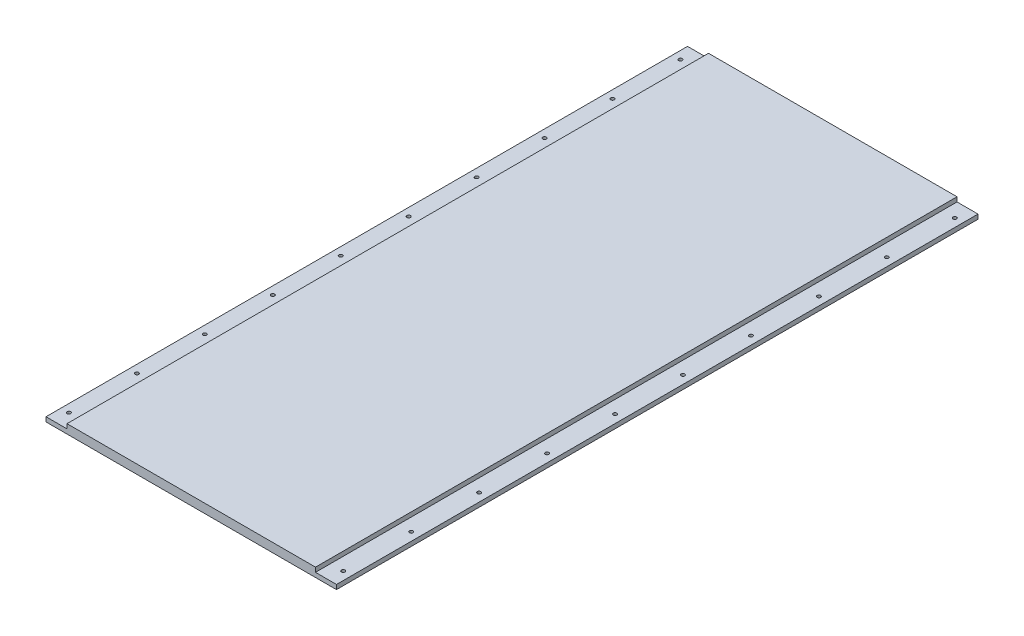
ISO-10303-21;
HEADER;
FILE_DESCRIPTION(('STEP AP214'),'2;1');
FILE_NAME('part.step','',(''),(''),'','','');
FILE_SCHEMA(('AUTOMOTIVE_DESIGN { 1 0 10303 214 1 1 1 1 }'));
ENDSEC;
DATA;
#1=APPLICATION_CONTEXT('core data for automotive mechanical design processes');
#2=APPLICATION_PROTOCOL_DEFINITION('international standard','automotive_design',2000,#1);
#3=PRODUCT_CONTEXT('',#1,'mechanical');
#4=PRODUCT('Part','Part','',(#3));
#5=PRODUCT_RELATED_PRODUCT_CATEGORY('part','',(#4));
#6=PRODUCT_DEFINITION_FORMATION('','',#4);
#7=PRODUCT_DEFINITION_CONTEXT('part definition',#1,'design');
#8=PRODUCT_DEFINITION('design','',#6,#7);
#9=PRODUCT_DEFINITION_SHAPE('','',#8);
#10=(LENGTH_UNIT() NAMED_UNIT(*) SI_UNIT(.MILLI.,.METRE.));
#11=(NAMED_UNIT(*) PLANE_ANGLE_UNIT() SI_UNIT($,.RADIAN.));
#12=(NAMED_UNIT(*) SI_UNIT($,.STERADIAN.) SOLID_ANGLE_UNIT());
#13=UNCERTAINTY_MEASURE_WITH_UNIT(LENGTH_MEASURE(1.E-05),#10,'distance_accuracy_value','');
#14=(GEOMETRIC_REPRESENTATION_CONTEXT(3) GLOBAL_UNCERTAINTY_ASSIGNED_CONTEXT((#13)) GLOBAL_UNIT_ASSIGNED_CONTEXT((#10,
#11,#12)) REPRESENTATION_CONTEXT('',''));
#15=CARTESIAN_POINT('',(0.,0.,0.));
#16=DIRECTION('',(0.,0.,1.));
#17=DIRECTION('',(1.,0.,0.));
#18=AXIS2_PLACEMENT_3D('',#15,#16,#17);
#19=CARTESIAN_POINT('',(-48.45,3.,107.));
#20=DIRECTION('',(1.,0.,0.));
#21=DIRECTION('',(0.,0.,-1.));
#22=AXIS2_PLACEMENT_3D('',#19,#20,#21);
#23=PLANE('',#22);
#24=DIRECTION('',(0.,0.,1.));
#25=VECTOR('',#24,1.);
#26=CARTESIAN_POINT('',(-48.45,1.5,-107.));
#27=LINE('',#26,#25);
#28=CARTESIAN_POINT('',(-48.45,1.5,-107.));
#29=VERTEX_POINT('',#28);
#30=CARTESIAN_POINT('',(-48.45,1.5,107.));
#31=VERTEX_POINT('',#30);
#32=EDGE_CURVE('E119',#29,#31,#27,.T.);
#33=ORIENTED_EDGE('',*,*,#32,.F.);
#34=DIRECTION('',(0.,-1.,0.));
#35=VECTOR('',#34,1.);
#36=CARTESIAN_POINT('',(-48.45,3.,-107.));
#37=LINE('',#36,#35);
#38=CARTESIAN_POINT('',(-48.45,0.,-107.));
#39=VERTEX_POINT('',#38);
#40=EDGE_CURVE('E51',#29,#39,#37,.T.);
#41=ORIENTED_EDGE('',*,*,#40,.T.);
#42=DIRECTION('',(0.,0.,1.));
#43=VECTOR('',#42,1.);
#44=CARTESIAN_POINT('',(-48.45,0.,107.));
#45=LINE('',#44,#43);
#46=CARTESIAN_POINT('',(-48.45,0.,107.));
#47=VERTEX_POINT('',#46);
#48=EDGE_CURVE('E142',#39,#47,#45,.T.);
#49=ORIENTED_EDGE('',*,*,#48,.T.);
#50=DIRECTION('',(0.,-1.,0.));
#51=VECTOR('',#50,1.);
#52=CARTESIAN_POINT('',(-48.45,3.,107.));
#53=LINE('',#52,#51);
#54=EDGE_CURVE('E136',#31,#47,#53,.T.);
#55=ORIENTED_EDGE('',*,*,#54,.F.);
#56=EDGE_LOOP('',(#33,#41,#49,#55));
#57=FACE_BOUND('',#56,.T.);
#58=ADVANCED_FACE('F41',(#57),#23,.F.);
#59=CARTESIAN_POINT('',(48.45,3.,107.));
#60=DIRECTION('',(-1.,0.,0.));
#61=DIRECTION('',(0.,0.,1.));
#62=AXIS2_PLACEMENT_3D('',#59,#60,#61);
#63=PLANE('',#62);
#64=DIRECTION('',(0.,-1.,0.));
#65=VECTOR('',#64,1.);
#66=CARTESIAN_POINT('',(48.45,3.,-107.));
#67=LINE('',#66,#65);
#68=CARTESIAN_POINT('',(48.45,1.5,-107.));
#69=VERTEX_POINT('',#68);
#70=CARTESIAN_POINT('',(48.45,0.,-107.));
#71=VERTEX_POINT('',#70);
#72=EDGE_CURVE('E11',#69,#71,#67,.T.);
#73=ORIENTED_EDGE('',*,*,#72,.F.);
#74=DIRECTION('',(0.,0.,-1.));
#75=VECTOR('',#74,1.);
#76=CARTESIAN_POINT('',(48.45,1.5,-107.));
#77=LINE('',#76,#75);
#78=CARTESIAN_POINT('',(48.45,1.5,107.));
#79=VERTEX_POINT('',#78);
#80=EDGE_CURVE('E314',#79,#69,#77,.T.);
#81=ORIENTED_EDGE('',*,*,#80,.F.);
#82=DIRECTION('',(0.,-1.,0.));
#83=VECTOR('',#82,1.);
#84=CARTESIAN_POINT('',(48.45,3.,107.));
#85=LINE('',#84,#83);
#86=CARTESIAN_POINT('',(48.45,0.,107.));
#87=VERTEX_POINT('',#86);
#88=EDGE_CURVE('E145',#79,#87,#85,.T.);
#89=ORIENTED_EDGE('',*,*,#88,.T.);
#90=DIRECTION('',(0.,0.,-1.));
#91=VECTOR('',#90,1.);
#92=CARTESIAN_POINT('',(48.45,0.,107.));
#93=LINE('',#92,#91);
#94=EDGE_CURVE('E333',#87,#71,#93,.T.);
#95=ORIENTED_EDGE('',*,*,#94,.T.);
#96=EDGE_LOOP('',(#73,#81,#89,#95));
#97=FACE_BOUND('',#96,.T.);
#98=ADVANCED_FACE('F43',(#97),#63,.F.);
#99=CARTESIAN_POINT('',(-48.45,3.,-107.));
#100=DIRECTION('',(0.,0.,1.));
#101=DIRECTION('',(1.,0.,0.));
#102=AXIS2_PLACEMENT_3D('',#99,#100,#101);
#103=PLANE('',#102);
#104=DIRECTION('',(-1.,0.,0.));
#105=VECTOR('',#104,1.);
#106=CARTESIAN_POINT('',(-48.45,1.5,-107.));
#107=LINE('',#106,#105);
#108=CARTESIAN_POINT('',(-41.45,1.5,-107.));
#109=VERTEX_POINT('',#108);
#110=EDGE_CURVE('E125',#109,#29,#107,.T.);
#111=ORIENTED_EDGE('',*,*,#110,.F.);
#112=DIRECTION('',(0.,1.,0.));
#113=VECTOR('',#112,1.);
#114=CARTESIAN_POINT('',(-41.45,1.5,-107.));
#115=LINE('',#114,#113);
#116=CARTESIAN_POINT('',(-41.45,3.,-107.));
#117=VERTEX_POINT('',#116);
#118=EDGE_CURVE('E309',#109,#117,#115,.T.);
#119=ORIENTED_EDGE('',*,*,#118,.T.);
#120=DIRECTION('',(-1.,0.,0.));
#121=VECTOR('',#120,1.);
#122=CARTESIAN_POINT('',(-48.45,3.,-107.));
#123=LINE('',#122,#121);
#124=CARTESIAN_POINT('',(41.45,3.,-107.));
#125=VERTEX_POINT('',#124);
#126=EDGE_CURVE('E336',#125,#117,#123,.T.);
#127=ORIENTED_EDGE('',*,*,#126,.F.);
#128=DIRECTION('',(0.,1.,0.));
#129=VECTOR('',#128,1.);
#130=CARTESIAN_POINT('',(41.45,1.5,-107.));
#131=LINE('',#130,#129);
#132=CARTESIAN_POINT('',(41.45,1.5,-107.));
#133=VERTEX_POINT('',#132);
#134=EDGE_CURVE('E71',#133,#125,#131,.T.);
#135=ORIENTED_EDGE('',*,*,#134,.F.);
#136=DIRECTION('',(-1.,0.,0.));
#137=VECTOR('',#136,1.);
#138=CARTESIAN_POINT('',(48.45,1.5,-107.));
#139=LINE('',#138,#137);
#140=EDGE_CURVE('E317',#69,#133,#139,.T.);
#141=ORIENTED_EDGE('',*,*,#140,.F.);
#142=ORIENTED_EDGE('',*,*,#72,.T.);
#143=DIRECTION('',(-1.,0.,0.));
#144=VECTOR('',#143,1.);
#145=CARTESIAN_POINT('',(-48.45,0.,-107.));
#146=LINE('',#145,#144);
#147=EDGE_CURVE('E346',#71,#39,#146,.T.);
#148=ORIENTED_EDGE('',*,*,#147,.T.);
#149=ORIENTED_EDGE('',*,*,#40,.F.);
#150=EDGE_LOOP('',(#111,#119,#127,#135,#141,#142,#148,#149));
#151=FACE_BOUND('',#150,.T.);
#152=ADVANCED_FACE('F365',(#151),#103,.F.);
#153=CARTESIAN_POINT('',(-48.45,3.,107.));
#154=DIRECTION('',(0.,0.,-1.));
#155=DIRECTION('',(-1.,0.,0.));
#156=AXIS2_PLACEMENT_3D('',#153,#154,#155);
#157=PLANE('',#156);
#158=DIRECTION('',(1.,0.,0.));
#159=VECTOR('',#158,1.);
#160=CARTESIAN_POINT('',(-48.45,3.,107.));
#161=LINE('',#160,#159);
#162=CARTESIAN_POINT('',(-41.45,3.,107.));
#163=VERTEX_POINT('',#162);
#164=CARTESIAN_POINT('',(41.45,3.,107.));
#165=VERTEX_POINT('',#164);
#166=EDGE_CURVE('E149',#163,#165,#161,.T.);
#167=ORIENTED_EDGE('',*,*,#166,.F.);
#168=DIRECTION('',(0.,1.,0.));
#169=VECTOR('',#168,1.);
#170=CARTESIAN_POINT('',(-41.45,1.5,107.));
#171=LINE('',#170,#169);
#172=CARTESIAN_POINT('',(-41.45,1.5,107.));
#173=VERTEX_POINT('',#172);
#174=EDGE_CURVE('E62',#173,#163,#171,.T.);
#175=ORIENTED_EDGE('',*,*,#174,.F.);
#176=DIRECTION('',(1.,0.,0.));
#177=VECTOR('',#176,1.);
#178=CARTESIAN_POINT('',(-48.45,1.5,107.));
#179=LINE('',#178,#177);
#180=EDGE_CURVE('E123',#31,#173,#179,.T.);
#181=ORIENTED_EDGE('',*,*,#180,.F.);
#182=ORIENTED_EDGE('',*,*,#54,.T.);
#183=DIRECTION('',(1.,0.,0.));
#184=VECTOR('',#183,1.);
#185=CARTESIAN_POINT('',(-48.45,0.,107.));
#186=LINE('',#185,#184);
#187=EDGE_CURVE('E340',#47,#87,#186,.T.);
#188=ORIENTED_EDGE('',*,*,#187,.T.);
#189=ORIENTED_EDGE('',*,*,#88,.F.);
#190=DIRECTION('',(1.,0.,0.));
#191=VECTOR('',#190,1.);
#192=CARTESIAN_POINT('',(48.45,1.5,107.));
#193=LINE('',#192,#191);
#194=CARTESIAN_POINT('',(41.45,1.5,107.));
#195=VERTEX_POINT('',#194);
#196=EDGE_CURVE('E325',#195,#79,#193,.T.);
#197=ORIENTED_EDGE('',*,*,#196,.F.);
#198=DIRECTION('',(0.,1.,0.));
#199=VECTOR('',#198,1.);
#200=CARTESIAN_POINT('',(41.45,1.5,107.));
#201=LINE('',#200,#199);
#202=EDGE_CURVE('E329',#195,#165,#201,.T.);
#203=ORIENTED_EDGE('',*,*,#202,.T.);
#204=EDGE_LOOP('',(#167,#175,#181,#182,#188,#189,#197,#203));
#205=FACE_BOUND('',#204,.T.);
#206=ADVANCED_FACE('F134',(#205),#157,.F.);
#207=CARTESIAN_POINT('',(0.,3.,0.));
#208=DIRECTION('',(0.,-1.,0.));
#209=DIRECTION('',(0.,0.,-1.));
#210=AXIS2_PLACEMENT_3D('',#207,#208,#209);
#211=PLANE('',#210);
#212=ORIENTED_EDGE('',*,*,#126,.T.);
#213=DIRECTION('',(0.,0.,-1.));
#214=VECTOR('',#213,1.);
#215=CARTESIAN_POINT('',(-41.45,3.,-107.));
#216=LINE('',#215,#214);
#217=EDGE_CURVE('E130',#163,#117,#216,.T.);
#218=ORIENTED_EDGE('',*,*,#217,.F.);
#219=ORIENTED_EDGE('',*,*,#166,.T.);
#220=DIRECTION('',(0.,0.,1.));
#221=VECTOR('',#220,1.);
#222=CARTESIAN_POINT('',(41.45,3.,-107.));
#223=LINE('',#222,#221);
#224=EDGE_CURVE('E312',#125,#165,#223,.T.);
#225=ORIENTED_EDGE('',*,*,#224,.F.);
#226=EDGE_LOOP('',(#212,#218,#219,#225));
#227=FACE_BOUND('',#226,.T.);
#228=ADVANCED_FACE('F368',(#227),#211,.F.);
#229=CARTESIAN_POINT('',(0.,0.,0.));
#230=DIRECTION('',(0.,-1.,0.));
#231=DIRECTION('',(0.,0.,-1.));
#232=AXIS2_PLACEMENT_3D('',#229,#230,#231);
#233=PLANE('',#232);
#234=CARTESIAN_POINT('',(45.7,0.,102.));
#235=DIRECTION('',(0.,-1.,0.));
#236=DIRECTION('',(0.,0.,-1.));
#237=AXIS2_PLACEMENT_3D('',#234,#235,#236);
#238=CIRCLE('',#237,0.59563);
#239=CARTESIAN_POINT('',(45.7,0.,101.40437));
#240=VERTEX_POINT('',#239);
#241=EDGE_CURVE('E45',#240,#240,#238,.T.);
#242=ORIENTED_EDGE('',*,*,#241,.F.);
#243=EDGE_LOOP('',(#242));
#244=FACE_BOUND('',#243,.T.);
#245=CARTESIAN_POINT('',(-45.8,0.,102.));
#246=DIRECTION('',(0.,-1.,0.));
#247=DIRECTION('',(0.,0.,-1.));
#248=AXIS2_PLACEMENT_3D('',#245,#246,#247);
#249=CIRCLE('',#248,0.59563);
#250=CARTESIAN_POINT('',(-45.8,0.,101.40437));
#251=VERTEX_POINT('',#250);
#252=EDGE_CURVE('E238',#251,#251,#249,.T.);
#253=ORIENTED_EDGE('',*,*,#252,.F.);
#254=EDGE_LOOP('',(#253));
#255=FACE_BOUND('',#254,.T.);
#256=CARTESIAN_POINT('',(45.7000000000002,0.,79.3333333333333));
#257=DIRECTION('',(0.,-1.,0.));
#258=DIRECTION('',(0.,0.,-1.));
#259=AXIS2_PLACEMENT_3D('',#256,#257,#258);
#260=CIRCLE('',#259,0.59563);
#261=CARTESIAN_POINT('',(45.7000000000002,0.,78.7377033333333));
#262=VERTEX_POINT('',#261);
#263=EDGE_CURVE('E234',#262,#262,#260,.T.);
#264=ORIENTED_EDGE('',*,*,#263,.F.);
#265=EDGE_LOOP('',(#264));
#266=FACE_BOUND('',#265,.T.);
#267=CARTESIAN_POINT('',(-45.7999999999997,0.,79.3333333333333));
#268=DIRECTION('',(0.,-1.,0.));
#269=DIRECTION('',(0.,0.,-1.));
#270=AXIS2_PLACEMENT_3D('',#267,#268,#269);
#271=CIRCLE('',#270,0.59563);
#272=CARTESIAN_POINT('',(-45.7999999999997,0.,78.7377033333333));
#273=VERTEX_POINT('',#272);
#274=EDGE_CURVE('E229',#273,#273,#271,.T.);
#275=ORIENTED_EDGE('',*,*,#274,.F.);
#276=EDGE_LOOP('',(#275));
#277=FACE_BOUND('',#276,.T.);
#278=CARTESIAN_POINT('',(45.7000000000005,0.,56.6666666666667));
#279=DIRECTION('',(0.,-1.,0.));
#280=DIRECTION('',(0.,0.,-1.));
#281=AXIS2_PLACEMENT_3D('',#278,#279,#280);
#282=CIRCLE('',#281,0.59563);
#283=CARTESIAN_POINT('',(45.7000000000005,0.,56.0710366666667));
#284=VERTEX_POINT('',#283);
#285=EDGE_CURVE('E224',#284,#284,#282,.T.);
#286=ORIENTED_EDGE('',*,*,#285,.F.);
#287=EDGE_LOOP('',(#286));
#288=FACE_BOUND('',#287,.T.);
#289=CARTESIAN_POINT('',(-45.7999999999995,0.,56.6666666666666));
#290=DIRECTION('',(0.,-1.,0.));
#291=DIRECTION('',(0.,0.,-1.));
#292=AXIS2_PLACEMENT_3D('',#289,#290,#291);
#293=CIRCLE('',#292,0.59563);
#294=CARTESIAN_POINT('',(-45.7999999999995,0.,56.0710366666666));
#295=VERTEX_POINT('',#294);
#296=EDGE_CURVE('E219',#295,#295,#293,.T.);
#297=ORIENTED_EDGE('',*,*,#296,.F.);
#298=EDGE_LOOP('',(#297));
#299=FACE_BOUND('',#298,.T.);
#300=CARTESIAN_POINT('',(45.7000000000007,0.,34.));
#301=DIRECTION('',(0.,-1.,0.));
#302=DIRECTION('',(0.,0.,-1.));
#303=AXIS2_PLACEMENT_3D('',#300,#301,#302);
#304=CIRCLE('',#303,0.59563);
#305=CARTESIAN_POINT('',(45.7000000000007,0.,33.40437));
#306=VERTEX_POINT('',#305);
#307=EDGE_CURVE('E215',#306,#306,#304,.T.);
#308=ORIENTED_EDGE('',*,*,#307,.F.);
#309=EDGE_LOOP('',(#308));
#310=FACE_BOUND('',#309,.T.);
#311=CARTESIAN_POINT('',(-45.7999999999993,0.,34.));
#312=DIRECTION('',(0.,-1.,0.));
#313=DIRECTION('',(0.,0.,-1.));
#314=AXIS2_PLACEMENT_3D('',#311,#312,#313);
#315=CIRCLE('',#314,0.59563);
#316=CARTESIAN_POINT('',(-45.7999999999993,0.,33.40437));
#317=VERTEX_POINT('',#316);
#318=EDGE_CURVE('E211',#317,#317,#315,.T.);
#319=ORIENTED_EDGE('',*,*,#318,.F.);
#320=EDGE_LOOP('',(#319));
#321=FACE_BOUND('',#320,.T.);
#322=CARTESIAN_POINT('',(45.7000000000009,0.,11.3333333333333));
#323=DIRECTION('',(0.,-1.,0.));
#324=DIRECTION('',(0.,0.,-1.));
#325=AXIS2_PLACEMENT_3D('',#322,#323,#324);
#326=CIRCLE('',#325,0.59563);
#327=CARTESIAN_POINT('',(45.7000000000009,0.,10.7377033333333));
#328=VERTEX_POINT('',#327);
#329=EDGE_CURVE('E206',#328,#328,#326,.T.);
#330=ORIENTED_EDGE('',*,*,#329,.F.);
#331=EDGE_LOOP('',(#330));
#332=FACE_BOUND('',#331,.T.);
#333=CARTESIAN_POINT('',(-45.799999999999,0.,11.3333333333333));
#334=DIRECTION('',(0.,-1.,0.));
#335=DIRECTION('',(0.,0.,-1.));
#336=AXIS2_PLACEMENT_3D('',#333,#334,#335);
#337=CIRCLE('',#336,0.59563);
#338=CARTESIAN_POINT('',(-45.799999999999,0.,10.7377033333333));
#339=VERTEX_POINT('',#338);
#340=EDGE_CURVE('E201',#339,#339,#337,.T.);
#341=ORIENTED_EDGE('',*,*,#340,.F.);
#342=EDGE_LOOP('',(#341));
#343=FACE_BOUND('',#342,.T.);
#344=CARTESIAN_POINT('',(45.7000000000012,0.,-11.3333333333333));
#345=DIRECTION('',(0.,-1.,0.));
#346=DIRECTION('',(0.,0.,-1.));
#347=AXIS2_PLACEMENT_3D('',#344,#345,#346);
#348=CIRCLE('',#347,0.59563);
#349=CARTESIAN_POINT('',(45.7000000000012,0.,-11.9289633333333));
#350=VERTEX_POINT('',#349);
#351=EDGE_CURVE('E196',#350,#350,#348,.T.);
#352=ORIENTED_EDGE('',*,*,#351,.F.);
#353=EDGE_LOOP('',(#352));
#354=FACE_BOUND('',#353,.T.);
#355=CARTESIAN_POINT('',(-45.7999999999988,0.,-11.3333333333334));
#356=DIRECTION('',(0.,-1.,0.));
#357=DIRECTION('',(0.,0.,-1.));
#358=AXIS2_PLACEMENT_3D('',#355,#356,#357);
#359=CIRCLE('',#358,0.59563);
#360=CARTESIAN_POINT('',(-45.7999999999988,0.,-11.9289633333334));
#361=VERTEX_POINT('',#360);
#362=EDGE_CURVE('E192',#361,#361,#359,.T.);
#363=ORIENTED_EDGE('',*,*,#362,.F.);
#364=EDGE_LOOP('',(#363));
#365=FACE_BOUND('',#364,.T.);
#366=CARTESIAN_POINT('',(45.7000000000014,0.,-34.));
#367=DIRECTION('',(0.,-1.,0.));
#368=DIRECTION('',(0.,0.,-1.));
#369=AXIS2_PLACEMENT_3D('',#366,#367,#368);
#370=CIRCLE('',#369,0.59563);
#371=CARTESIAN_POINT('',(45.7000000000014,0.,-34.59563));
#372=VERTEX_POINT('',#371);
#373=EDGE_CURVE('E188',#372,#372,#370,.T.);
#374=ORIENTED_EDGE('',*,*,#373,.F.);
#375=EDGE_LOOP('',(#374));
#376=FACE_BOUND('',#375,.T.);
#377=CARTESIAN_POINT('',(-45.7999999999986,0.,-34.));
#378=DIRECTION('',(0.,-1.,0.));
#379=DIRECTION('',(0.,0.,-1.));
#380=AXIS2_PLACEMENT_3D('',#377,#378,#379);
#381=CIRCLE('',#380,0.59563);
#382=CARTESIAN_POINT('',(-45.7999999999986,0.,-34.59563));
#383=VERTEX_POINT('',#382);
#384=EDGE_CURVE('E183',#383,#383,#381,.T.);
#385=ORIENTED_EDGE('',*,*,#384,.F.);
#386=EDGE_LOOP('',(#385));
#387=FACE_BOUND('',#386,.T.);
#388=CARTESIAN_POINT('',(45.7000000000016,0.,-56.6666666666666));
#389=DIRECTION('',(0.,-1.,0.));
#390=DIRECTION('',(0.,0.,-1.));
#391=AXIS2_PLACEMENT_3D('',#388,#389,#390);
#392=CIRCLE('',#391,0.59563);
#393=CARTESIAN_POINT('',(45.7000000000016,0.,-57.2622966666666));
#394=VERTEX_POINT('',#393);
#395=EDGE_CURVE('E179',#394,#394,#392,.T.);
#396=ORIENTED_EDGE('',*,*,#395,.F.);
#397=EDGE_LOOP('',(#396));
#398=FACE_BOUND('',#397,.T.);
#399=CARTESIAN_POINT('',(-45.7999999999983,0.,-56.6666666666667));
#400=DIRECTION('',(0.,-1.,0.));
#401=DIRECTION('',(0.,0.,-1.));
#402=AXIS2_PLACEMENT_3D('',#399,#400,#401);
#403=CIRCLE('',#402,0.59563);
#404=CARTESIAN_POINT('',(-45.7999999999983,0.,-57.2622966666667));
#405=VERTEX_POINT('',#404);
#406=EDGE_CURVE('E173',#405,#405,#403,.T.);
#407=ORIENTED_EDGE('',*,*,#406,.F.);
#408=EDGE_LOOP('',(#407));
#409=FACE_BOUND('',#408,.T.);
#410=CARTESIAN_POINT('',(45.7000000000019,0.,-79.3333333333333));
#411=DIRECTION('',(0.,-1.,0.));
#412=DIRECTION('',(0.,0.,-1.));
#413=AXIS2_PLACEMENT_3D('',#410,#411,#412);
#414=CIRCLE('',#413,0.59563);
#415=CARTESIAN_POINT('',(45.7000000000019,0.,-79.9289633333333));
#416=VERTEX_POINT('',#415);
#417=EDGE_CURVE('E169',#416,#416,#414,.T.);
#418=ORIENTED_EDGE('',*,*,#417,.F.);
#419=EDGE_LOOP('',(#418));
#420=FACE_BOUND('',#419,.T.);
#421=CARTESIAN_POINT('',(-45.7999999999981,0.,-79.3333333333333));
#422=DIRECTION('',(0.,-1.,0.));
#423=DIRECTION('',(0.,0.,-1.));
#424=AXIS2_PLACEMENT_3D('',#421,#422,#423);
#425=CIRCLE('',#424,0.59563);
#426=CARTESIAN_POINT('',(-45.7999999999981,0.,-79.9289633333333));
#427=VERTEX_POINT('',#426);
#428=EDGE_CURVE('E164',#427,#427,#425,.T.);
#429=ORIENTED_EDGE('',*,*,#428,.F.);
#430=EDGE_LOOP('',(#429));
#431=FACE_BOUND('',#430,.T.);
#432=CARTESIAN_POINT('',(45.7000000000021,0.,-102.));
#433=DIRECTION('',(0.,-1.,0.));
#434=DIRECTION('',(0.,0.,-1.));
#435=AXIS2_PLACEMENT_3D('',#432,#433,#434);
#436=CIRCLE('',#435,0.59563);
#437=CARTESIAN_POINT('',(45.7000000000021,0.,-102.59563));
#438=VERTEX_POINT('',#437);
#439=EDGE_CURVE('E159',#438,#438,#436,.T.);
#440=ORIENTED_EDGE('',*,*,#439,.F.);
#441=EDGE_LOOP('',(#440));
#442=FACE_BOUND('',#441,.T.);
#443=CARTESIAN_POINT('',(-45.7999999999979,0.,-102.));
#444=DIRECTION('',(0.,-1.,0.));
#445=DIRECTION('',(0.,0.,-1.));
#446=AXIS2_PLACEMENT_3D('',#443,#444,#445);
#447=CIRCLE('',#446,0.59563);
#448=CARTESIAN_POINT('',(-45.7999999999979,0.,-102.59563));
#449=VERTEX_POINT('',#448);
#450=EDGE_CURVE('E157',#449,#449,#447,.T.);
#451=ORIENTED_EDGE('',*,*,#450,.F.);
#452=EDGE_LOOP('',(#451));
#453=FACE_BOUND('',#452,.T.);
#454=ORIENTED_EDGE('',*,*,#94,.F.);
#455=ORIENTED_EDGE('',*,*,#187,.F.);
#456=ORIENTED_EDGE('',*,*,#48,.F.);
#457=ORIENTED_EDGE('',*,*,#147,.F.);
#458=EDGE_LOOP('',(#454,#455,#456,#457));
#459=FACE_BOUND('',#458,.T.);
#460=ADVANCED_FACE('F357',(#244,#255,#266,#277,#288,#299,#310,#321,#332,#343,#354,#365,#376,
#387,#398,#409,#420,#431,#442,#453,#459),#233,.T.);
#461=CARTESIAN_POINT('',(41.45,1.5,-107.));
#462=DIRECTION('',(-1.,0.,0.));
#463=DIRECTION('',(0.,0.,1.));
#464=AXIS2_PLACEMENT_3D('',#461,#462,#463);
#465=PLANE('',#464);
#466=ORIENTED_EDGE('',*,*,#224,.T.);
#467=ORIENTED_EDGE('',*,*,#202,.F.);
#468=DIRECTION('',(0.,0.,1.));
#469=VECTOR('',#468,1.);
#470=CARTESIAN_POINT('',(41.45,1.5,-107.));
#471=LINE('',#470,#469);
#472=EDGE_CURVE('E321',#133,#195,#471,.T.);
#473=ORIENTED_EDGE('',*,*,#472,.F.);
#474=ORIENTED_EDGE('',*,*,#134,.T.);
#475=EDGE_LOOP('',(#466,#467,#473,#474));
#476=FACE_BOUND('',#475,.T.);
#477=ADVANCED_FACE('F369',(#476),#465,.F.);
#478=CARTESIAN_POINT('',(0.,1.5,0.));
#479=DIRECTION('',(0.,-1.,0.));
#480=DIRECTION('',(0.,0.,-1.));
#481=AXIS2_PLACEMENT_3D('',#478,#479,#480);
#482=PLANE('',#481);
#483=CARTESIAN_POINT('',(45.7,1.5,102.));
#484=DIRECTION('',(0.,-1.,0.));
#485=DIRECTION('',(0.,0.,-1.));
#486=AXIS2_PLACEMENT_3D('',#483,#484,#485);
#487=CIRCLE('',#486,0.59563);
#488=CARTESIAN_POINT('',(45.7,1.5,101.40437));
#489=VERTEX_POINT('',#488);
#490=EDGE_CURVE('E241',#489,#489,#487,.T.);
#491=ORIENTED_EDGE('',*,*,#490,.T.);
#492=EDGE_LOOP('',(#491));
#493=FACE_BOUND('',#492,.T.);
#494=CARTESIAN_POINT('',(45.7000000000002,1.5,79.3333333333333));
#495=DIRECTION('',(0.,-1.,0.));
#496=DIRECTION('',(0.,0.,-1.));
#497=AXIS2_PLACEMENT_3D('',#494,#495,#496);
#498=CIRCLE('',#497,0.59563);
#499=CARTESIAN_POINT('',(45.7000000000002,1.5,78.7377033333333));
#500=VERTEX_POINT('',#499);
#501=EDGE_CURVE('E233',#500,#500,#498,.T.);
#502=ORIENTED_EDGE('',*,*,#501,.T.);
#503=EDGE_LOOP('',(#502));
#504=FACE_BOUND('',#503,.T.);
#505=CARTESIAN_POINT('',(45.7000000000005,1.5,56.6666666666667));
#506=DIRECTION('',(0.,-1.,0.));
#507=DIRECTION('',(0.,0.,-1.));
#508=AXIS2_PLACEMENT_3D('',#505,#506,#507);
#509=CIRCLE('',#508,0.59563);
#510=CARTESIAN_POINT('',(45.7000000000005,1.5,56.0710366666667));
#511=VERTEX_POINT('',#510);
#512=EDGE_CURVE('E223',#511,#511,#509,.T.);
#513=ORIENTED_EDGE('',*,*,#512,.T.);
#514=EDGE_LOOP('',(#513));
#515=FACE_BOUND('',#514,.T.);
#516=CARTESIAN_POINT('',(45.7000000000007,1.5,34.));
#517=DIRECTION('',(0.,-1.,0.));
#518=DIRECTION('',(0.,0.,-1.));
#519=AXIS2_PLACEMENT_3D('',#516,#517,#518);
#520=CIRCLE('',#519,0.59563);
#521=CARTESIAN_POINT('',(45.7000000000007,1.5,33.40437));
#522=VERTEX_POINT('',#521);
#523=EDGE_CURVE('E214',#522,#522,#520,.T.);
#524=ORIENTED_EDGE('',*,*,#523,.T.);
#525=EDGE_LOOP('',(#524));
#526=FACE_BOUND('',#525,.T.);
#527=CARTESIAN_POINT('',(45.7000000000009,1.5,11.3333333333333));
#528=DIRECTION('',(0.,-1.,0.));
#529=DIRECTION('',(0.,0.,-1.));
#530=AXIS2_PLACEMENT_3D('',#527,#528,#529);
#531=CIRCLE('',#530,0.59563);
#532=CARTESIAN_POINT('',(45.7000000000009,1.5,10.7377033333333));
#533=VERTEX_POINT('',#532);
#534=EDGE_CURVE('E205',#533,#533,#531,.T.);
#535=ORIENTED_EDGE('',*,*,#534,.T.);
#536=EDGE_LOOP('',(#535));
#537=FACE_BOUND('',#536,.T.);
#538=CARTESIAN_POINT('',(45.7000000000012,1.5,-11.3333333333333));
#539=DIRECTION('',(0.,-1.,0.));
#540=DIRECTION('',(0.,0.,-1.));
#541=AXIS2_PLACEMENT_3D('',#538,#539,#540);
#542=CIRCLE('',#541,0.59563);
#543=CARTESIAN_POINT('',(45.7000000000012,1.5,-11.9289633333333));
#544=VERTEX_POINT('',#543);
#545=EDGE_CURVE('E195',#544,#544,#542,.T.);
#546=ORIENTED_EDGE('',*,*,#545,.T.);
#547=EDGE_LOOP('',(#546));
#548=FACE_BOUND('',#547,.T.);
#549=CARTESIAN_POINT('',(45.7000000000014,1.5,-34.));
#550=DIRECTION('',(0.,-1.,0.));
#551=DIRECTION('',(0.,0.,-1.));
#552=AXIS2_PLACEMENT_3D('',#549,#550,#551);
#553=CIRCLE('',#552,0.59563);
#554=CARTESIAN_POINT('',(45.7000000000014,1.5,-34.59563));
#555=VERTEX_POINT('',#554);
#556=EDGE_CURVE('E187',#555,#555,#553,.T.);
#557=ORIENTED_EDGE('',*,*,#556,.T.);
#558=EDGE_LOOP('',(#557));
#559=FACE_BOUND('',#558,.T.);
#560=CARTESIAN_POINT('',(45.7000000000016,1.5,-56.6666666666666));
#561=DIRECTION('',(0.,-1.,0.));
#562=DIRECTION('',(0.,0.,-1.));
#563=AXIS2_PLACEMENT_3D('',#560,#561,#562);
#564=CIRCLE('',#563,0.59563);
#565=CARTESIAN_POINT('',(45.7000000000016,1.5,-57.2622966666666));
#566=VERTEX_POINT('',#565);
#567=EDGE_CURVE('E178',#566,#566,#564,.T.);
#568=ORIENTED_EDGE('',*,*,#567,.T.);
#569=EDGE_LOOP('',(#568));
#570=FACE_BOUND('',#569,.T.);
#571=CARTESIAN_POINT('',(45.7000000000019,1.5,-79.3333333333333));
#572=DIRECTION('',(0.,-1.,0.));
#573=DIRECTION('',(0.,0.,-1.));
#574=AXIS2_PLACEMENT_3D('',#571,#572,#573);
#575=CIRCLE('',#574,0.59563);
#576=CARTESIAN_POINT('',(45.7000000000019,1.5,-79.9289633333333));
#577=VERTEX_POINT('',#576);
#578=EDGE_CURVE('E168',#577,#577,#575,.T.);
#579=ORIENTED_EDGE('',*,*,#578,.T.);
#580=EDGE_LOOP('',(#579));
#581=FACE_BOUND('',#580,.T.);
#582=CARTESIAN_POINT('',(45.7000000000021,1.5,-102.));
#583=DIRECTION('',(0.,-1.,0.));
#584=DIRECTION('',(0.,0.,-1.));
#585=AXIS2_PLACEMENT_3D('',#582,#583,#584);
#586=CIRCLE('',#585,0.59563);
#587=CARTESIAN_POINT('',(45.7000000000021,1.5,-102.59563));
#588=VERTEX_POINT('',#587);
#589=EDGE_CURVE('E158',#588,#588,#586,.T.);
#590=ORIENTED_EDGE('',*,*,#589,.T.);
#591=EDGE_LOOP('',(#590));
#592=FACE_BOUND('',#591,.T.);
#593=ORIENTED_EDGE('',*,*,#80,.T.);
#594=ORIENTED_EDGE('',*,*,#140,.T.);
#595=ORIENTED_EDGE('',*,*,#472,.T.);
#596=ORIENTED_EDGE('',*,*,#196,.T.);
#597=EDGE_LOOP('',(#593,#594,#595,#596));
#598=FACE_BOUND('',#597,.T.);
#599=ADVANCED_FACE('F363',(#493,#504,#515,#526,#537,#548,#559,#570,#581,#592,#598),#482,.F.);
#600=CARTESIAN_POINT('',(-41.45,1.5,-107.));
#601=DIRECTION('',(1.,0.,0.));
#602=DIRECTION('',(0.,0.,-1.));
#603=AXIS2_PLACEMENT_3D('',#600,#601,#602);
#604=PLANE('',#603);
#605=ORIENTED_EDGE('',*,*,#217,.T.);
#606=ORIENTED_EDGE('',*,*,#118,.F.);
#607=DIRECTION('',(0.,0.,-1.));
#608=VECTOR('',#607,1.);
#609=CARTESIAN_POINT('',(-41.45,1.5,-107.));
#610=LINE('',#609,#608);
#611=EDGE_CURVE('E139',#173,#109,#610,.T.);
#612=ORIENTED_EDGE('',*,*,#611,.F.);
#613=ORIENTED_EDGE('',*,*,#174,.T.);
#614=EDGE_LOOP('',(#605,#606,#612,#613));
#615=FACE_BOUND('',#614,.T.);
#616=ADVANCED_FACE('F375',(#615),#604,.F.);
#617=CARTESIAN_POINT('',(0.,1.5,0.));
#618=DIRECTION('',(0.,1.,0.));
#619=DIRECTION('',(0.,0.,1.));
#620=AXIS2_PLACEMENT_3D('',#617,#618,#619);
#621=PLANE('',#620);
#622=CARTESIAN_POINT('',(-45.8,1.5,102.));
#623=DIRECTION('',(0.,1.,0.));
#624=DIRECTION('',(0.,0.,1.));
#625=AXIS2_PLACEMENT_3D('',#622,#623,#624);
#626=CIRCLE('',#625,0.59563);
#627=CARTESIAN_POINT('',(-45.8,1.5,102.59563));
#628=VERTEX_POINT('',#627);
#629=EDGE_CURVE('E237',#628,#628,#626,.T.);
#630=ORIENTED_EDGE('',*,*,#629,.F.);
#631=EDGE_LOOP('',(#630));
#632=FACE_BOUND('',#631,.T.);
#633=CARTESIAN_POINT('',(-45.7999999999997,1.5,79.3333333333333));
#634=DIRECTION('',(0.,1.,0.));
#635=DIRECTION('',(0.,0.,1.));
#636=AXIS2_PLACEMENT_3D('',#633,#634,#635);
#637=CIRCLE('',#636,0.59563);
#638=CARTESIAN_POINT('',(-45.7999999999997,1.5,79.9289633333333));
#639=VERTEX_POINT('',#638);
#640=EDGE_CURVE('E228',#639,#639,#637,.T.);
#641=ORIENTED_EDGE('',*,*,#640,.F.);
#642=EDGE_LOOP('',(#641));
#643=FACE_BOUND('',#642,.T.);
#644=CARTESIAN_POINT('',(-45.7999999999995,1.5,56.6666666666666));
#645=DIRECTION('',(0.,1.,0.));
#646=DIRECTION('',(0.,0.,1.));
#647=AXIS2_PLACEMENT_3D('',#644,#645,#646);
#648=CIRCLE('',#647,0.59563);
#649=CARTESIAN_POINT('',(-45.7999999999995,1.5,57.2622966666666));
#650=VERTEX_POINT('',#649);
#651=EDGE_CURVE('E218',#650,#650,#648,.T.);
#652=ORIENTED_EDGE('',*,*,#651,.F.);
#653=EDGE_LOOP('',(#652));
#654=FACE_BOUND('',#653,.T.);
#655=CARTESIAN_POINT('',(-45.7999999999993,1.5,34.));
#656=DIRECTION('',(0.,1.,0.));
#657=DIRECTION('',(0.,0.,1.));
#658=AXIS2_PLACEMENT_3D('',#655,#656,#657);
#659=CIRCLE('',#658,0.59563);
#660=CARTESIAN_POINT('',(-45.7999999999993,1.5,34.59563));
#661=VERTEX_POINT('',#660);
#662=EDGE_CURVE('E210',#661,#661,#659,.T.);
#663=ORIENTED_EDGE('',*,*,#662,.F.);
#664=EDGE_LOOP('',(#663));
#665=FACE_BOUND('',#664,.T.);
#666=CARTESIAN_POINT('',(-45.799999999999,1.5,11.3333333333333));
#667=DIRECTION('',(0.,1.,0.));
#668=DIRECTION('',(0.,0.,1.));
#669=AXIS2_PLACEMENT_3D('',#666,#667,#668);
#670=CIRCLE('',#669,0.59563);
#671=CARTESIAN_POINT('',(-45.799999999999,1.5,11.9289633333333));
#672=VERTEX_POINT('',#671);
#673=EDGE_CURVE('E200',#672,#672,#670,.T.);
#674=ORIENTED_EDGE('',*,*,#673,.F.);
#675=EDGE_LOOP('',(#674));
#676=FACE_BOUND('',#675,.T.);
#677=CARTESIAN_POINT('',(-45.7999999999988,1.5,-11.3333333333334));
#678=DIRECTION('',(0.,1.,0.));
#679=DIRECTION('',(0.,0.,1.));
#680=AXIS2_PLACEMENT_3D('',#677,#678,#679);
#681=CIRCLE('',#680,0.59563);
#682=CARTESIAN_POINT('',(-45.7999999999988,1.5,-10.7377033333334));
#683=VERTEX_POINT('',#682);
#684=EDGE_CURVE('E191',#683,#683,#681,.T.);
#685=ORIENTED_EDGE('',*,*,#684,.F.);
#686=EDGE_LOOP('',(#685));
#687=FACE_BOUND('',#686,.T.);
#688=CARTESIAN_POINT('',(-45.7999999999986,1.5,-34.));
#689=DIRECTION('',(0.,1.,0.));
#690=DIRECTION('',(0.,0.,1.));
#691=AXIS2_PLACEMENT_3D('',#688,#689,#690);
#692=CIRCLE('',#691,0.59563);
#693=CARTESIAN_POINT('',(-45.7999999999986,1.5,-33.40437));
#694=VERTEX_POINT('',#693);
#695=EDGE_CURVE('E182',#694,#694,#692,.T.);
#696=ORIENTED_EDGE('',*,*,#695,.F.);
#697=EDGE_LOOP('',(#696));
#698=FACE_BOUND('',#697,.T.);
#699=CARTESIAN_POINT('',(-45.7999999999983,1.5,-56.6666666666667));
#700=DIRECTION('',(0.,1.,0.));
#701=DIRECTION('',(0.,0.,1.));
#702=AXIS2_PLACEMENT_3D('',#699,#700,#701);
#703=CIRCLE('',#702,0.59563);
#704=CARTESIAN_POINT('',(-45.7999999999983,1.5,-56.0710366666667));
#705=VERTEX_POINT('',#704);
#706=EDGE_CURVE('E174',#705,#705,#703,.T.);
#707=ORIENTED_EDGE('',*,*,#706,.F.);
#708=EDGE_LOOP('',(#707));
#709=FACE_BOUND('',#708,.T.);
#710=CARTESIAN_POINT('',(-45.7999999999981,1.5,-79.3333333333333));
#711=DIRECTION('',(0.,1.,0.));
#712=DIRECTION('',(0.,0.,1.));
#713=AXIS2_PLACEMENT_3D('',#710,#711,#712);
#714=CIRCLE('',#713,0.59563);
#715=CARTESIAN_POINT('',(-45.7999999999981,1.5,-78.7377033333333));
#716=VERTEX_POINT('',#715);
#717=EDGE_CURVE('E163',#716,#716,#714,.T.);
#718=ORIENTED_EDGE('',*,*,#717,.F.);
#719=EDGE_LOOP('',(#718));
#720=FACE_BOUND('',#719,.T.);
#721=CARTESIAN_POINT('',(-45.7999999999979,1.5,-102.));
#722=DIRECTION('',(0.,1.,0.));
#723=DIRECTION('',(0.,0.,1.));
#724=AXIS2_PLACEMENT_3D('',#721,#722,#723);
#725=CIRCLE('',#724,0.59563);
#726=CARTESIAN_POINT('',(-45.7999999999979,1.5,-101.40437));
#727=VERTEX_POINT('',#726);
#728=EDGE_CURVE('E153',#727,#727,#725,.T.);
#729=ORIENTED_EDGE('',*,*,#728,.F.);
#730=EDGE_LOOP('',(#729));
#731=FACE_BOUND('',#730,.T.);
#732=ORIENTED_EDGE('',*,*,#32,.T.);
#733=ORIENTED_EDGE('',*,*,#180,.T.);
#734=ORIENTED_EDGE('',*,*,#611,.T.);
#735=ORIENTED_EDGE('',*,*,#110,.T.);
#736=EDGE_LOOP('',(#732,#733,#734,#735));
#737=FACE_BOUND('',#736,.T.);
#738=ADVANCED_FACE('F121',(#632,#643,#654,#665,#676,#687,#698,#709,#720,#731,#737),#621,.T.);
#739=CARTESIAN_POINT('',(-45.7999999999979,3.,-102.));
#740=DIRECTION('',(0.,1.,0.));
#741=DIRECTION('',(0.,0.,1.));
#742=AXIS2_PLACEMENT_3D('',#739,#740,#741);
#743=CYLINDRICAL_SURFACE('',#742,0.59563);
#744=ORIENTED_EDGE('',*,*,#450,.T.);
#745=EDGE_LOOP('',(#744));
#746=FACE_BOUND('',#745,.T.);
#747=ORIENTED_EDGE('',*,*,#728,.T.);
#748=EDGE_LOOP('',(#747));
#749=FACE_BOUND('',#748,.T.);
#750=ADVANCED_FACE('F432',(#746,#749),#743,.F.);
#751=CARTESIAN_POINT('',(45.7000000000021,3.,-102.));
#752=DIRECTION('',(0.,1.,0.));
#753=DIRECTION('',(0.,0.,1.));
#754=AXIS2_PLACEMENT_3D('',#751,#752,#753);
#755=CYLINDRICAL_SURFACE('',#754,0.59563);
#756=ORIENTED_EDGE('',*,*,#439,.T.);
#757=EDGE_LOOP('',(#756));
#758=FACE_BOUND('',#757,.T.);
#759=ORIENTED_EDGE('',*,*,#589,.F.);
#760=EDGE_LOOP('',(#759));
#761=FACE_BOUND('',#760,.T.);
#762=ADVANCED_FACE('F443',(#758,#761),#755,.F.);
#763=CARTESIAN_POINT('',(-45.7999999999981,3.,-79.3333333333333));
#764=DIRECTION('',(0.,1.,0.));
#765=DIRECTION('',(0.,0.,1.));
#766=AXIS2_PLACEMENT_3D('',#763,#764,#765);
#767=CYLINDRICAL_SURFACE('',#766,0.59563);
#768=ORIENTED_EDGE('',*,*,#717,.T.);
#769=EDGE_LOOP('',(#768));
#770=FACE_BOUND('',#769,.T.);
#771=ORIENTED_EDGE('',*,*,#428,.T.);
#772=EDGE_LOOP('',(#771));
#773=FACE_BOUND('',#772,.T.);
#774=ADVANCED_FACE('F450',(#770,#773),#767,.F.);
#775=CARTESIAN_POINT('',(45.7000000000019,3.,-79.3333333333333));
#776=DIRECTION('',(0.,1.,0.));
#777=DIRECTION('',(0.,0.,1.));
#778=AXIS2_PLACEMENT_3D('',#775,#776,#777);
#779=CYLINDRICAL_SURFACE('',#778,0.59563);
#780=ORIENTED_EDGE('',*,*,#417,.T.);
#781=EDGE_LOOP('',(#780));
#782=FACE_BOUND('',#781,.T.);
#783=ORIENTED_EDGE('',*,*,#578,.F.);
#784=EDGE_LOOP('',(#783));
#785=FACE_BOUND('',#784,.T.);
#786=ADVANCED_FACE('F458',(#782,#785),#779,.F.);
#787=CARTESIAN_POINT('',(-45.7999999999983,3.,-56.6666666666667));
#788=DIRECTION('',(0.,1.,0.));
#789=DIRECTION('',(0.,0.,1.));
#790=AXIS2_PLACEMENT_3D('',#787,#788,#789);
#791=CYLINDRICAL_SURFACE('',#790,0.59563);
#792=ORIENTED_EDGE('',*,*,#406,.T.);
#793=EDGE_LOOP('',(#792));
#794=FACE_BOUND('',#793,.T.);
#795=ORIENTED_EDGE('',*,*,#706,.T.);
#796=EDGE_LOOP('',(#795));
#797=FACE_BOUND('',#796,.T.);
#798=ADVANCED_FACE('F466',(#794,#797),#791,.F.);
#799=CARTESIAN_POINT('',(45.7000000000016,3.,-56.6666666666666));
#800=DIRECTION('',(0.,1.,0.));
#801=DIRECTION('',(0.,0.,1.));
#802=AXIS2_PLACEMENT_3D('',#799,#800,#801);
#803=CYLINDRICAL_SURFACE('',#802,0.59563);
#804=ORIENTED_EDGE('',*,*,#395,.T.);
#805=EDGE_LOOP('',(#804));
#806=FACE_BOUND('',#805,.T.);
#807=ORIENTED_EDGE('',*,*,#567,.F.);
#808=EDGE_LOOP('',(#807));
#809=FACE_BOUND('',#808,.T.);
#810=ADVANCED_FACE('F474',(#806,#809),#803,.F.);
#811=CARTESIAN_POINT('',(-45.7999999999986,3.,-34.));
#812=DIRECTION('',(0.,1.,0.));
#813=DIRECTION('',(0.,0.,1.));
#814=AXIS2_PLACEMENT_3D('',#811,#812,#813);
#815=CYLINDRICAL_SURFACE('',#814,0.59563);
#816=ORIENTED_EDGE('',*,*,#695,.T.);
#817=EDGE_LOOP('',(#816));
#818=FACE_BOUND('',#817,.T.);
#819=ORIENTED_EDGE('',*,*,#384,.T.);
#820=EDGE_LOOP('',(#819));
#821=FACE_BOUND('',#820,.T.);
#822=ADVANCED_FACE('F482',(#818,#821),#815,.F.);
#823=CARTESIAN_POINT('',(45.7000000000014,3.,-34.));
#824=DIRECTION('',(0.,1.,0.));
#825=DIRECTION('',(0.,0.,1.));
#826=AXIS2_PLACEMENT_3D('',#823,#824,#825);
#827=CYLINDRICAL_SURFACE('',#826,0.59563);
#828=ORIENTED_EDGE('',*,*,#373,.T.);
#829=EDGE_LOOP('',(#828));
#830=FACE_BOUND('',#829,.T.);
#831=ORIENTED_EDGE('',*,*,#556,.F.);
#832=EDGE_LOOP('',(#831));
#833=FACE_BOUND('',#832,.T.);
#834=ADVANCED_FACE('F490',(#830,#833),#827,.F.);
#835=CARTESIAN_POINT('',(-45.7999999999988,3.,-11.3333333333334));
#836=DIRECTION('',(0.,1.,0.));
#837=DIRECTION('',(0.,0.,1.));
#838=AXIS2_PLACEMENT_3D('',#835,#836,#837);
#839=CYLINDRICAL_SURFACE('',#838,0.59563);
#840=ORIENTED_EDGE('',*,*,#684,.T.);
#841=EDGE_LOOP('',(#840));
#842=FACE_BOUND('',#841,.T.);
#843=ORIENTED_EDGE('',*,*,#362,.T.);
#844=EDGE_LOOP('',(#843));
#845=FACE_BOUND('',#844,.T.);
#846=ADVANCED_FACE('F498',(#842,#845),#839,.F.);
#847=CARTESIAN_POINT('',(45.7000000000012,3.,-11.3333333333333));
#848=DIRECTION('',(0.,1.,0.));
#849=DIRECTION('',(0.,0.,1.));
#850=AXIS2_PLACEMENT_3D('',#847,#848,#849);
#851=CYLINDRICAL_SURFACE('',#850,0.59563);
#852=ORIENTED_EDGE('',*,*,#351,.T.);
#853=EDGE_LOOP('',(#852));
#854=FACE_BOUND('',#853,.T.);
#855=ORIENTED_EDGE('',*,*,#545,.F.);
#856=EDGE_LOOP('',(#855));
#857=FACE_BOUND('',#856,.T.);
#858=ADVANCED_FACE('F506',(#854,#857),#851,.F.);
#859=CARTESIAN_POINT('',(-45.799999999999,3.,11.3333333333333));
#860=DIRECTION('',(0.,1.,0.));
#861=DIRECTION('',(0.,0.,1.));
#862=AXIS2_PLACEMENT_3D('',#859,#860,#861);
#863=CYLINDRICAL_SURFACE('',#862,0.59563);
#864=ORIENTED_EDGE('',*,*,#673,.T.);
#865=EDGE_LOOP('',(#864));
#866=FACE_BOUND('',#865,.T.);
#867=ORIENTED_EDGE('',*,*,#340,.T.);
#868=EDGE_LOOP('',(#867));
#869=FACE_BOUND('',#868,.T.);
#870=ADVANCED_FACE('F514',(#866,#869),#863,.F.);
#871=CARTESIAN_POINT('',(45.7000000000009,3.,11.3333333333333));
#872=DIRECTION('',(0.,1.,0.));
#873=DIRECTION('',(0.,0.,1.));
#874=AXIS2_PLACEMENT_3D('',#871,#872,#873);
#875=CYLINDRICAL_SURFACE('',#874,0.59563);
#876=ORIENTED_EDGE('',*,*,#329,.T.);
#877=EDGE_LOOP('',(#876));
#878=FACE_BOUND('',#877,.T.);
#879=ORIENTED_EDGE('',*,*,#534,.F.);
#880=EDGE_LOOP('',(#879));
#881=FACE_BOUND('',#880,.T.);
#882=ADVANCED_FACE('F522',(#878,#881),#875,.F.);
#883=CARTESIAN_POINT('',(-45.7999999999993,3.,34.));
#884=DIRECTION('',(0.,1.,0.));
#885=DIRECTION('',(0.,0.,1.));
#886=AXIS2_PLACEMENT_3D('',#883,#884,#885);
#887=CYLINDRICAL_SURFACE('',#886,0.59563);
#888=ORIENTED_EDGE('',*,*,#662,.T.);
#889=EDGE_LOOP('',(#888));
#890=FACE_BOUND('',#889,.T.);
#891=ORIENTED_EDGE('',*,*,#318,.T.);
#892=EDGE_LOOP('',(#891));
#893=FACE_BOUND('',#892,.T.);
#894=ADVANCED_FACE('F530',(#890,#893),#887,.F.);
#895=CARTESIAN_POINT('',(45.7000000000007,3.,34.));
#896=DIRECTION('',(0.,1.,0.));
#897=DIRECTION('',(0.,0.,1.));
#898=AXIS2_PLACEMENT_3D('',#895,#896,#897);
#899=CYLINDRICAL_SURFACE('',#898,0.59563);
#900=ORIENTED_EDGE('',*,*,#307,.T.);
#901=EDGE_LOOP('',(#900));
#902=FACE_BOUND('',#901,.T.);
#903=ORIENTED_EDGE('',*,*,#523,.F.);
#904=EDGE_LOOP('',(#903));
#905=FACE_BOUND('',#904,.T.);
#906=ADVANCED_FACE('F538',(#902,#905),#899,.F.);
#907=CARTESIAN_POINT('',(-45.7999999999995,3.,56.6666666666666));
#908=DIRECTION('',(0.,1.,0.));
#909=DIRECTION('',(0.,0.,1.));
#910=AXIS2_PLACEMENT_3D('',#907,#908,#909);
#911=CYLINDRICAL_SURFACE('',#910,0.59563);
#912=ORIENTED_EDGE('',*,*,#651,.T.);
#913=EDGE_LOOP('',(#912));
#914=FACE_BOUND('',#913,.T.);
#915=ORIENTED_EDGE('',*,*,#296,.T.);
#916=EDGE_LOOP('',(#915));
#917=FACE_BOUND('',#916,.T.);
#918=ADVANCED_FACE('F546',(#914,#917),#911,.F.);
#919=CARTESIAN_POINT('',(45.7000000000005,3.,56.6666666666667));
#920=DIRECTION('',(0.,1.,0.));
#921=DIRECTION('',(0.,0.,1.));
#922=AXIS2_PLACEMENT_3D('',#919,#920,#921);
#923=CYLINDRICAL_SURFACE('',#922,0.59563);
#924=ORIENTED_EDGE('',*,*,#285,.T.);
#925=EDGE_LOOP('',(#924));
#926=FACE_BOUND('',#925,.T.);
#927=ORIENTED_EDGE('',*,*,#512,.F.);
#928=EDGE_LOOP('',(#927));
#929=FACE_BOUND('',#928,.T.);
#930=ADVANCED_FACE('F554',(#926,#929),#923,.F.);
#931=CARTESIAN_POINT('',(-45.7999999999997,3.,79.3333333333333));
#932=DIRECTION('',(0.,1.,0.));
#933=DIRECTION('',(0.,0.,1.));
#934=AXIS2_PLACEMENT_3D('',#931,#932,#933);
#935=CYLINDRICAL_SURFACE('',#934,0.59563);
#936=ORIENTED_EDGE('',*,*,#640,.T.);
#937=EDGE_LOOP('',(#936));
#938=FACE_BOUND('',#937,.T.);
#939=ORIENTED_EDGE('',*,*,#274,.T.);
#940=EDGE_LOOP('',(#939));
#941=FACE_BOUND('',#940,.T.);
#942=ADVANCED_FACE('F562',(#938,#941),#935,.F.);
#943=CARTESIAN_POINT('',(45.7000000000002,3.,79.3333333333333));
#944=DIRECTION('',(0.,1.,0.));
#945=DIRECTION('',(0.,0.,1.));
#946=AXIS2_PLACEMENT_3D('',#943,#944,#945);
#947=CYLINDRICAL_SURFACE('',#946,0.59563);
#948=ORIENTED_EDGE('',*,*,#263,.T.);
#949=EDGE_LOOP('',(#948));
#950=FACE_BOUND('',#949,.T.);
#951=ORIENTED_EDGE('',*,*,#501,.F.);
#952=EDGE_LOOP('',(#951));
#953=FACE_BOUND('',#952,.T.);
#954=ADVANCED_FACE('F570',(#950,#953),#947,.F.);
#955=CARTESIAN_POINT('',(-45.8,3.,102.));
#956=DIRECTION('',(0.,1.,0.));
#957=DIRECTION('',(0.,0.,1.));
#958=AXIS2_PLACEMENT_3D('',#955,#956,#957);
#959=CYLINDRICAL_SURFACE('',#958,0.59563);
#960=ORIENTED_EDGE('',*,*,#629,.T.);
#961=EDGE_LOOP('',(#960));
#962=FACE_BOUND('',#961,.T.);
#963=ORIENTED_EDGE('',*,*,#252,.T.);
#964=EDGE_LOOP('',(#963));
#965=FACE_BOUND('',#964,.T.);
#966=ADVANCED_FACE('F578',(#962,#965),#959,.F.);
#967=CARTESIAN_POINT('',(45.7,3.,102.));
#968=DIRECTION('',(0.,1.,0.));
#969=DIRECTION('',(0.,0.,1.));
#970=AXIS2_PLACEMENT_3D('',#967,#968,#969);
#971=CYLINDRICAL_SURFACE('',#970,0.59563);
#972=ORIENTED_EDGE('',*,*,#241,.T.);
#973=EDGE_LOOP('',(#972));
#974=FACE_BOUND('',#973,.T.);
#975=ORIENTED_EDGE('',*,*,#490,.F.);
#976=EDGE_LOOP('',(#975));
#977=FACE_BOUND('',#976,.T.);
#978=ADVANCED_FACE('F586',(#974,#977),#971,.F.);
#979=CLOSED_SHELL('',(#58,#98,#152,#206,#228,#460,#477,#599,#616,#738,#750,#762,#774,#786,#798,
#810,#822,#834,#846,#858,#870,#882,#894,#906,#918,#930,#942,#954,#966,#978));
#980=MANIFOLD_SOLID_BREP('B2',#979);
#981=ADVANCED_BREP_SHAPE_REPRESENTATION('',(#18,#980),#14);
#982=SHAPE_DEFINITION_REPRESENTATION(#9,#981);
ENDSEC;
END-ISO-10303-21;
